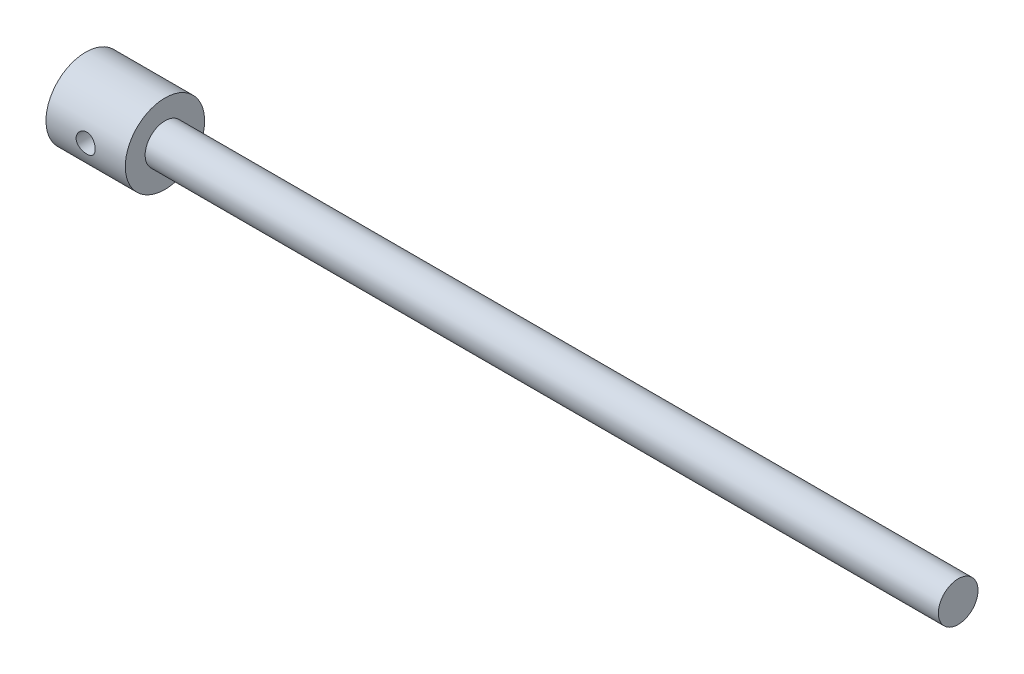
ISO-10303-21;
HEADER;
FILE_DESCRIPTION(('STEP AP214'),'2;1');
FILE_NAME('part.step','',(''),(''),'','','');
FILE_SCHEMA(('AUTOMOTIVE_DESIGN { 1 0 10303 214 1 1 1 1 }'));
ENDSEC;
DATA;
#1=APPLICATION_CONTEXT('core data for automotive mechanical design processes');
#2=APPLICATION_PROTOCOL_DEFINITION('international standard','automotive_design',2000,#1);
#3=PRODUCT_CONTEXT('',#1,'mechanical');
#4=PRODUCT('Part','Part','',(#3));
#5=PRODUCT_RELATED_PRODUCT_CATEGORY('part','',(#4));
#6=PRODUCT_DEFINITION_FORMATION('','',#4);
#7=PRODUCT_DEFINITION_CONTEXT('part definition',#1,'design');
#8=PRODUCT_DEFINITION('design','',#6,#7);
#9=PRODUCT_DEFINITION_SHAPE('','',#8);
#10=(LENGTH_UNIT() NAMED_UNIT(*) SI_UNIT(.MILLI.,.METRE.));
#11=(NAMED_UNIT(*) PLANE_ANGLE_UNIT() SI_UNIT($,.RADIAN.));
#12=(NAMED_UNIT(*) SI_UNIT($,.STERADIAN.) SOLID_ANGLE_UNIT());
#13=UNCERTAINTY_MEASURE_WITH_UNIT(LENGTH_MEASURE(1.E-05),#10,'distance_accuracy_value','');
#14=(GEOMETRIC_REPRESENTATION_CONTEXT(3) GLOBAL_UNCERTAINTY_ASSIGNED_CONTEXT((#13)) GLOBAL_UNIT_ASSIGNED_CONTEXT((#10,
#11,#12)) REPRESENTATION_CONTEXT('',''));
#15=CARTESIAN_POINT('',(0.,0.,0.));
#16=DIRECTION('',(0.,0.,1.));
#17=DIRECTION('',(1.,0.,0.));
#18=AXIS2_PLACEMENT_3D('',#15,#16,#17);
#19=CARTESIAN_POINT('',(0.,0.,0.));
#20=DIRECTION('',(-1.,0.,0.));
#21=DIRECTION('',(0.,-1.,0.));
#22=AXIS2_PLACEMENT_3D('',#19,#20,#21);
#23=PLANE('',#22);
#24=CARTESIAN_POINT('',(0.,0.,0.));
#25=DIRECTION('',(1.,0.,0.));
#26=DIRECTION('',(0.,1.,0.));
#27=AXIS2_PLACEMENT_3D('',#24,#25,#26);
#28=CIRCLE('',#27,25.);
#29=CARTESIAN_POINT('',(0.,25.,0.));
#30=VERTEX_POINT('',#29);
#31=EDGE_CURVE('E59',#30,#30,#28,.T.);
#32=ORIENTED_EDGE('',*,*,#31,.F.);
#33=EDGE_LOOP('',(#32));
#34=FACE_BOUND('',#33,.T.);
#35=ADVANCED_FACE('F43',(#34),#23,.T.);
#36=CARTESIAN_POINT('',(550.,0.,0.));
#37=DIRECTION('',(1.,0.,0.));
#38=DIRECTION('',(0.,1.,0.));
#39=AXIS2_PLACEMENT_3D('',#36,#37,#38);
#40=CYLINDRICAL_SURFACE('',#39,25.);
#41=CARTESIAN_POINT('',(31.,0.,-25.));
#42=CARTESIAN_POINT('',(31.0000045654021,-0.166017736340745,-25.0000026804997));
#43=CARTESIAN_POINT('',(30.9931083315099,-0.331984064130571,-24.9983437383731));
#44=CARTESIAN_POINT('',(30.9655909900526,-0.662757375273785,-24.9917601768854));
#45=CARTESIAN_POINT('',(30.9449681517169,-0.827564209779564,-24.9868351457074));
#46=CARTESIAN_POINT('',(30.8901535848326,-1.15483168687375,-24.9738504635424));
#47=CARTESIAN_POINT('',(30.855957043403,-1.31729147606247,-24.9657897007271));
#48=CARTESIAN_POINT('',(30.7742619207701,-1.63872050759381,-24.9467537443302));
#49=CARTESIAN_POINT('',(30.7267584397992,-1.79768844089951,-24.9357774773038));
#50=CARTESIAN_POINT('',(30.6189154000372,-2.11072366381165,-24.9112316091515));
#51=CARTESIAN_POINT('',(30.5585957367627,-2.26479812859839,-24.897666030887));
#52=CARTESIAN_POINT('',(30.4255126504005,-2.56731972417304,-24.8682925860487));
#53=CARTESIAN_POINT('',(30.3527446342751,-2.71576475309531,-24.8524838922068));
#54=CARTESIAN_POINT('',(30.1953429094483,-3.00593509691774,-24.8190587739081));
#55=CARTESIAN_POINT('',(30.1107137253609,-3.14766294672407,-24.8014430394569));
#56=CARTESIAN_POINT('',(29.930128760191,-3.42359889441685,-24.7648612187919));
#57=CARTESIAN_POINT('',(29.8341687278593,-3.55780414185136,-24.7458946268123));
#58=CARTESIAN_POINT('',(29.6298945004368,-3.81996752921303,-24.7067947855154));
#59=CARTESIAN_POINT('',(29.5214001376863,-3.94778319107671,-24.6866473068088));
#60=CARTESIAN_POINT('',(29.2940876458784,-4.19391043753479,-24.6460277155742));
#61=CARTESIAN_POINT('',(29.1752657022346,-4.31221847908384,-24.6255554853983));
#62=CARTESIAN_POINT('',(28.9281491358483,-4.53846894982133,-24.5848634527513));
#63=CARTESIAN_POINT('',(28.7998569991231,-4.64641408237687,-24.5646435856504));
#64=CARTESIAN_POINT('',(28.5345631328875,-4.85128465634762,-24.5250062264423));
#65=CARTESIAN_POINT('',(28.3975582064557,-4.94820601608992,-24.5055890332168));
#66=CARTESIAN_POINT('',(28.1139109412451,-5.1315149308875,-24.4678652790419));
#67=CARTESIAN_POINT('',(27.9671650785524,-5.21774615640803,-24.4495768107614));
#68=CARTESIAN_POINT('',(27.6666458172853,-5.37754406139993,-24.4149279468241));
#69=CARTESIAN_POINT('',(27.5128697930405,-5.45110595933349,-24.3985682798489));
#70=CARTESIAN_POINT('',(27.1994677660297,-5.58492026214268,-24.3682865029779));
#71=CARTESIAN_POINT('',(27.0398446450393,-5.64517912327471,-24.354363211339));
#72=CARTESIAN_POINT('',(26.7158528745254,-5.75195806967358,-24.3293636773731));
#73=CARTESIAN_POINT('',(26.5514825437586,-5.79847322039682,-24.3182884578029));
#74=CARTESIAN_POINT('',(26.0591991958386,-5.91523377010967,-24.2902598679583));
#75=CARTESIAN_POINT('',(25.7258747491139,-5.96534620186162,-24.2778811042379));
#76=CARTESIAN_POINT('',(25.2235243982438,-5.99819895021148,-24.2697663322526));
#77=CARTESIAN_POINT('',(25.055614512631,-6.00209048242323,-24.2688053008257));
#78=CARTESIAN_POINT('',(24.7200533387406,-5.99581246294926,-24.2703574949623));
#79=CARTESIAN_POINT('',(24.5524020533586,-5.98564275494965,-24.2728707591485));
#80=CARTESIAN_POINT('',(24.0592354379643,-5.93483975630032,-24.285368999466));
#81=CARTESIAN_POINT('',(23.7356610926301,-5.87440247397773,-24.3001939850224));
#82=CARTESIAN_POINT('',(23.1035551402389,-5.70184242669471,-24.3412549446464));
#83=CARTESIAN_POINT('',(22.7950245310886,-5.58971623816142,-24.3674916745551));
#84=CARTESIAN_POINT('',(22.1981876883057,-5.3158825349441,-24.4286958367201));
#85=CARTESIAN_POINT('',(21.9100987536133,-5.15371899452584,-24.4637429965247));
#86=CARTESIAN_POINT('',(21.3647873385141,-4.78473374953622,-24.5385748778448));
#87=CARTESIAN_POINT('',(21.1075698769835,-4.57790479882186,-24.5783603675971));
#88=CARTESIAN_POINT('',(20.6242138778088,-4.11902988641842,-24.6594640880418));
#89=CARTESIAN_POINT('',(20.3990660746999,-3.86594129003371,-24.7007951674045));
#90=CARTESIAN_POINT('',(19.9942302876759,-3.32511184695823,-24.7793903091839));
#91=CARTESIAN_POINT('',(19.8145434865743,-3.03737009894219,-24.8166542657671));
#92=CARTESIAN_POINT('',(19.5054056318309,-2.43405695507431,-24.8830789940348));
#93=CARTESIAN_POINT('',(19.3761051057317,-2.11840557448716,-24.9122154123614));
#94=CARTESIAN_POINT('',(19.1726698236987,-1.46899521159138,-24.9589240940734));
#95=CARTESIAN_POINT('',(19.0985253649671,-1.13523942521409,-24.9764983913503));
#96=CARTESIAN_POINT('',(19.0089958704804,-0.467574800827578,-24.9978055089126));
#97=CARTESIAN_POINT('',(18.9922601968733,-0.1338569665753,-25.0018564268946));
#98=CARTESIAN_POINT('',(19.0143335519038,0.531608768658084,-24.9965614831509));
#99=CARTESIAN_POINT('',(19.053137996564,0.863356829944316,-24.9872167270307));
#100=CARTESIAN_POINT('',(19.1840738854237,1.51084514007902,-24.9563832816127));
#101=CARTESIAN_POINT('',(19.2754779523593,1.8267410839496,-24.9350603275565));
#102=CARTESIAN_POINT('',(19.5081966502045,2.4387066749497,-24.8826669936479));
#103=CARTESIAN_POINT('',(19.6495160816406,2.73477441187555,-24.8515956762951));
#104=CARTESIAN_POINT('',(19.9807321749523,3.30412273668564,-24.7823820658762));
#105=CARTESIAN_POINT('',(20.171397626969,3.57694246966835,-24.7441307708391));
#106=CARTESIAN_POINT('',(20.5949176655097,4.08719914724014,-24.6649871461435));
#107=CARTESIAN_POINT('',(20.8277789307352,4.32463047973872,-24.6240943990594));
#108=CARTESIAN_POINT('',(21.3352671241418,4.76284500809665,-24.5431489449983));
#109=CARTESIAN_POINT('',(21.6107154179113,4.96268414096836,-24.5031358001301));
#110=CARTESIAN_POINT('',(22.1922356795911,5.31333575577366,-24.4295058119813));
#111=CARTESIAN_POINT('',(22.4983062754937,5.46415043292341,-24.395888682328));
#112=CARTESIAN_POINT('',(22.9725936839859,5.64963439053451,-24.353347630646));
#113=CARTESIAN_POINT('',(23.1328069566145,5.70458710242878,-24.3405033891164));
#114=CARTESIAN_POINT('',(23.457482020032,5.80079732294278,-24.317755202926));
#115=CARTESIAN_POINT('',(23.6219421871433,5.84205998439171,-24.3078501521252));
#116=CARTESIAN_POINT('',(23.9539179032292,5.91053741786634,-24.2912903166139));
#117=CARTESIAN_POINT('',(24.1214335511052,5.93775173433045,-24.2846356373073));
#118=CARTESIAN_POINT('',(24.4582664668551,5.97789965204539,-24.2747841701866));
#119=CARTESIAN_POINT('',(24.6275836538608,5.99083389159895,-24.2715872278157));
#120=CARTESIAN_POINT('',(24.9622487305118,6.00215499594078,-24.2687899616173));
#121=CARTESIAN_POINT('',(25.1275832844736,6.00091722515411,-24.2690968340135));
#122=CARTESIAN_POINT('',(25.4575435219348,5.98480872784869,-24.2730742483489));
#123=CARTESIAN_POINT('',(25.6221692208079,5.969938298505,-24.2767447169658));
#124=CARTESIAN_POINT('',(25.9495546015662,5.92668661056588,-24.2873399112073));
#125=CARTESIAN_POINT('',(26.1123139864982,5.89830323162515,-24.294265147542));
#126=CARTESIAN_POINT('',(26.4347302014815,5.82827196779405,-24.3111608262961));
#127=CARTESIAN_POINT('',(26.59438810625,5.78662876790753,-24.3211301931022));
#128=CARTESIAN_POINT('',(26.9088075189712,5.69063662986335,-24.3437686465433));
#129=CARTESIAN_POINT('',(27.0635886271826,5.63634876916799,-24.3564247302984));
#130=CARTESIAN_POINT('',(27.3679533881392,5.51539707483437,-24.3840980883562));
#131=CARTESIAN_POINT('',(27.5175388295994,5.44873755154826,-24.3991145400161));
#132=CARTESIAN_POINT('',(27.8106621669156,5.30348427217981,-24.4310987091682));
#133=CARTESIAN_POINT('',(27.9541973483356,5.22488523075194,-24.4480672900111));
#134=CARTESIAN_POINT('',(28.2341911451689,5.05635243091258,-24.4834782828489));
#135=CARTESIAN_POINT('',(28.3706520835145,4.96642242689347,-24.5019202059306));
#136=CARTESIAN_POINT('',(28.6389503832923,4.77346921711415,-24.5402505889388));
#137=CARTESIAN_POINT('',(28.7705923311298,4.67017903544834,-24.5601634300573));
#138=CARTESIAN_POINT('',(29.02470841849,4.45304880482868,-24.600458146359));
#139=CARTESIAN_POINT('',(29.1471856811229,4.33921237965749,-24.6208398586377));
#140=CARTESIAN_POINT('',(29.3822931129819,4.10164015488732,-24.661530300392));
#141=CARTESIAN_POINT('',(29.4949174263774,3.97789855094998,-24.6818389796797));
#142=CARTESIAN_POINT('',(29.7094481047576,3.7214296777047,-24.7218081005976));
#143=CARTESIAN_POINT('',(29.8113583669331,3.58870570477298,-24.7414687761375));
#144=CARTESIAN_POINT('',(30.0054239224954,3.31280088827595,-24.7799327781136));
#145=CARTESIAN_POINT('',(30.0973872483625,3.16948213881108,-24.7987162302532));
#146=CARTESIAN_POINT('',(30.2688530722884,2.87543817634771,-24.8345280560803));
#147=CARTESIAN_POINT('',(30.3483601559727,2.72471571591035,-24.8515570748485));
#148=CARTESIAN_POINT('',(30.4943122871475,2.41692354679156,-24.883375777664));
#149=CARTESIAN_POINT('',(30.5607634733439,2.25985686316148,-24.8981665133663));
#150=CARTESIAN_POINT('',(30.6801042720391,1.94048744711082,-24.9250921884147));
#151=CARTESIAN_POINT('',(30.7329960562763,1.77818555787967,-24.9372275530119));
#152=CARTESIAN_POINT('',(30.8520251734541,1.35190448336008,-24.9647957983314));
#153=CARTESIAN_POINT('',(30.9074241484908,1.08469226075994,-24.9779181465939));
#154=CARTESIAN_POINT('',(30.9814066442059,0.544940331071903,-24.9955177731159));
#155=CARTESIAN_POINT('',(30.9999925091139,0.272400964328516,-24.9999956018512));
#156=CARTESIAN_POINT('',(31.,0.,-25.));
#157=B_SPLINE_CURVE_WITH_KNOTS('',3,(#41,#42,#43,#44,#45,#46,#47,#48,#49,#50,#51,#52,#53,#54,
#55,#56,#57,#58,#59,#60,#61,#62,#63,#64,#65,#66,#67,#68,#69,#70,#71,#72,#73,#74,#75,#76,#77,#78,
#79,#80,#81,#82,#83,#84,#85,#86,#87,#88,#89,#90,#91,#92,#93,#94,#95,#96,#97,#98,#99,#100,#101,
#102,#103,#104,#105,#106,#107,#108,#109,#110,#111,#112,#113,#114,#115,#116,#117,#118,#119,#120,
#121,#122,#123,#124,#125,#126,#127,#128,#129,#130,#131,#132,#133,#134,#135,#136,#137,#138,#139,
#140,#141,#142,#143,#144,#145,#146,#147,#148,#149,#150,#151,#152,#153,#154,#155,#156),
.UNSPECIFIED.,.T.,.F.,(4,2,2,2,2,2,2,2,2,2,2,2,2,2,2,2,2,2,2,2,2,2,2,2,2,2,2,2,2,2,2,2,2,2,2,2,
2,2,2,2,2,2,2,2,2,2,2,2,2,2,2,2,2,2,2,2,2,4),(0.,0.497813360100955,0.995689500769747,
1.49374233325073,1.99197879609469,2.4894473877073,2.98709992652941,3.48456314269129,
3.98221359994714,4.48820831908741,4.99439073274951,5.50044073797176,6.00667750796929,
6.51961190143619,7.03273945954076,7.54561743540079,8.05867933189507,9.06463756237653,
9.56800871792682,10.0713854693234,11.0548629550302,12.0384055899336,13.0311908061742,
14.0241372047509,15.0430966233895,16.0620825507942,17.0840897493149,18.1059171185591,
19.1035329919673,20.1010665323702,21.085126203147,22.069280539993,23.0698021185097,
24.0704821968969,25.0936623603892,26.1167967016263,26.6258643414059,27.1347401541084,
27.6436324676663,28.1525020334114,28.6479253897995,29.1433379468293,29.6388282657176,
30.1341437102249,30.6271145113294,31.1199138801486,31.6129320389053,32.105787268885,
32.6107272666003,33.1154944014541,33.6205595212516,34.1254402854413,34.6387770201076,
35.1519243293048,35.6648297831432,36.1776530362049,36.9945144051894,37.8113237554193),.UNSPECIFIED.);
#158=CARTESIAN_POINT('',(31.,0.,-25.));
#159=VERTEX_POINT('',#158);
#160=EDGE_CURVE('E10',#159,#159,#157,.T.);
#161=ORIENTED_EDGE('',*,*,#160,.F.);
#162=EDGE_LOOP('',(#161));
#163=FACE_BOUND('',#162,.T.);
#164=CARTESIAN_POINT('',(31.,0.,25.));
#165=CARTESIAN_POINT('',(31.0000045654021,0.166017736340748,25.0000026804997));
#166=CARTESIAN_POINT('',(30.9931083315099,0.331984064130574,24.9983437383731));
#167=CARTESIAN_POINT('',(30.9655909900526,0.662757375273787,24.9917601768854));
#168=CARTESIAN_POINT('',(30.9449681517169,0.827564209779566,24.9868351457074));
#169=CARTESIAN_POINT('',(30.8901535848326,1.15483168687375,24.9738504635424));
#170=CARTESIAN_POINT('',(30.855957043403,1.31729147606248,24.9657897007271));
#171=CARTESIAN_POINT('',(30.7742619207701,1.63872050759382,24.9467537443302));
#172=CARTESIAN_POINT('',(30.7267584397992,1.79768844089951,24.9357774773038));
#173=CARTESIAN_POINT('',(30.6189154000372,2.11072366381165,24.9112316091515));
#174=CARTESIAN_POINT('',(30.5585957367627,2.26479812859839,24.897666030887));
#175=CARTESIAN_POINT('',(30.4255126504005,2.56731972417304,24.8682925860487));
#176=CARTESIAN_POINT('',(30.3527446342751,2.71576475309531,24.8524838922068));
#177=CARTESIAN_POINT('',(30.1953429094483,3.00593509691774,24.8190587739081));
#178=CARTESIAN_POINT('',(30.1107137253609,3.14766294672407,24.8014430394569));
#179=CARTESIAN_POINT('',(29.930128760191,3.42359889441685,24.7648612187919));
#180=CARTESIAN_POINT('',(29.8341687278593,3.55780414185136,24.7458946268123));
#181=CARTESIAN_POINT('',(29.6298945004368,3.81996752921303,24.7067947855154));
#182=CARTESIAN_POINT('',(29.5214001376863,3.94778319107671,24.6866473068088));
#183=CARTESIAN_POINT('',(29.2940876458784,4.19391043753479,24.6460277155742));
#184=CARTESIAN_POINT('',(29.1752657022346,4.31221847908384,24.6255554853983));
#185=CARTESIAN_POINT('',(28.9281491358483,4.53846894982133,24.5848634527513));
#186=CARTESIAN_POINT('',(28.7998569991231,4.64641408237687,24.5646435856504));
#187=CARTESIAN_POINT('',(28.5345631328875,4.85128465634762,24.5250062264423));
#188=CARTESIAN_POINT('',(28.3975582064557,4.94820601608992,24.5055890332168));
#189=CARTESIAN_POINT('',(28.1139109412451,5.1315149308875,24.4678652790419));
#190=CARTESIAN_POINT('',(27.9671650785524,5.21774615640803,24.4495768107614));
#191=CARTESIAN_POINT('',(27.6666458172853,5.37754406139993,24.4149279468241));
#192=CARTESIAN_POINT('',(27.5128697930405,5.45110595933349,24.3985682798489));
#193=CARTESIAN_POINT('',(27.1994677660297,5.58492026214268,24.3682865029779));
#194=CARTESIAN_POINT('',(27.0398446450393,5.64517912327471,24.354363211339));
#195=CARTESIAN_POINT('',(26.7158528745254,5.75195806967358,24.3293636773731));
#196=CARTESIAN_POINT('',(26.5514825437586,5.79847322039682,24.318288457803));
#197=CARTESIAN_POINT('',(26.0591991958386,5.91523377010968,24.2902598679583));
#198=CARTESIAN_POINT('',(25.7258747491139,5.96534620186162,24.2778811042379));
#199=CARTESIAN_POINT('',(25.2235243982438,5.99819895021148,24.2697663322526));
#200=CARTESIAN_POINT('',(25.055614512631,6.00209048242323,24.2688053008257));
#201=CARTESIAN_POINT('',(24.7200533387406,5.99581246294926,24.2703574949624));
#202=CARTESIAN_POINT('',(24.5524020533586,5.98564275494965,24.2728707591485));
#203=CARTESIAN_POINT('',(24.0592354379643,5.93483975630032,24.285368999466));
#204=CARTESIAN_POINT('',(23.7356610926301,5.87440247397773,24.3001939850224));
#205=CARTESIAN_POINT('',(23.1035551402389,5.70184242669471,24.3412549446464));
#206=CARTESIAN_POINT('',(22.7950245310886,5.58971623816142,24.3674916745551));
#207=CARTESIAN_POINT('',(22.1981876883057,5.3158825349441,24.4286958367201));
#208=CARTESIAN_POINT('',(21.9100987536133,5.15371899452584,24.4637429965247));
#209=CARTESIAN_POINT('',(21.3647873385141,4.78473374953621,24.5385748778448));
#210=CARTESIAN_POINT('',(21.1075698769834,4.57790479882186,24.5783603675971));
#211=CARTESIAN_POINT('',(20.6242138778088,4.11902988641842,24.6594640880418));
#212=CARTESIAN_POINT('',(20.3990660746999,3.86594129003371,24.7007951674045));
#213=CARTESIAN_POINT('',(19.9942302876759,3.32511184695823,24.7793903091839));
#214=CARTESIAN_POINT('',(19.8145434865743,3.03737009894219,24.8166542657671));
#215=CARTESIAN_POINT('',(19.5054056318309,2.43405695507431,24.8830789940348));
#216=CARTESIAN_POINT('',(19.3761051057317,2.11840557448716,24.9122154123614));
#217=CARTESIAN_POINT('',(19.1726698236987,1.46899521159138,24.9589240940734));
#218=CARTESIAN_POINT('',(19.0985253649671,1.13523942521409,24.9764983913503));
#219=CARTESIAN_POINT('',(19.0089958704804,0.467574800827575,24.9978055089126));
#220=CARTESIAN_POINT('',(18.9922601968733,0.133856966575298,25.0018564268946));
#221=CARTESIAN_POINT('',(19.0143335519038,-0.531608768658085,24.9965614831509));
#222=CARTESIAN_POINT('',(19.053137996564,-0.863356829944318,24.9872167270307));
#223=CARTESIAN_POINT('',(19.1840738854237,-1.51084514007902,24.9563832816127));
#224=CARTESIAN_POINT('',(19.2754779523593,-1.8267410839496,24.9350603275565));
#225=CARTESIAN_POINT('',(19.5081966502045,-2.4387066749497,24.8826669936479));
#226=CARTESIAN_POINT('',(19.6495160816406,-2.73477441187555,24.8515956762951));
#227=CARTESIAN_POINT('',(19.9807321749523,-3.30412273668564,24.7823820658762));
#228=CARTESIAN_POINT('',(20.171397626969,-3.57694246966835,24.7441307708391));
#229=CARTESIAN_POINT('',(20.5949176655097,-4.08719914724014,24.6649871461435));
#230=CARTESIAN_POINT('',(20.8277789307352,-4.32463047973872,24.6240943990594));
#231=CARTESIAN_POINT('',(21.3352671241418,-4.76284500809665,24.5431489449983));
#232=CARTESIAN_POINT('',(21.6107154179113,-4.96268414096836,24.5031358001301));
#233=CARTESIAN_POINT('',(22.1922356795911,-5.31333575577366,24.4295058119813));
#234=CARTESIAN_POINT('',(22.4983062754937,-5.46415043292341,24.395888682328));
#235=CARTESIAN_POINT('',(22.9725936839859,-5.64963439053451,24.353347630646));
#236=CARTESIAN_POINT('',(23.1328069566145,-5.70458710242878,24.3405033891164));
#237=CARTESIAN_POINT('',(23.457482020032,-5.80079732294278,24.317755202926));
#238=CARTESIAN_POINT('',(23.6219421871433,-5.84205998439171,24.3078501521252));
#239=CARTESIAN_POINT('',(23.9539179032292,-5.91053741786634,24.2912903166139));
#240=CARTESIAN_POINT('',(24.1214335511052,-5.93775173433045,24.2846356373073));
#241=CARTESIAN_POINT('',(24.4582664668551,-5.97789965204539,24.2747841701866));
#242=CARTESIAN_POINT('',(24.6275836538608,-5.99083389159895,24.2715872278157));
#243=CARTESIAN_POINT('',(24.9622487305118,-6.00215499594078,24.2687899616173));
#244=CARTESIAN_POINT('',(25.1275832844736,-6.00091722515411,24.2690968340135));
#245=CARTESIAN_POINT('',(25.4575435219348,-5.98480872784869,24.2730742483489));
#246=CARTESIAN_POINT('',(25.6221692208079,-5.969938298505,24.2767447169658));
#247=CARTESIAN_POINT('',(25.9495546015662,-5.92668661056588,24.2873399112073));
#248=CARTESIAN_POINT('',(26.1123139864983,-5.89830323162515,24.294265147542));
#249=CARTESIAN_POINT('',(26.4347302014815,-5.82827196779404,24.3111608262961));
#250=CARTESIAN_POINT('',(26.59438810625,-5.78662876790753,24.3211301931022));
#251=CARTESIAN_POINT('',(26.9088075189712,-5.69063662986335,24.3437686465433));
#252=CARTESIAN_POINT('',(27.0635886271826,-5.63634876916799,24.3564247302984));
#253=CARTESIAN_POINT('',(27.3679533881392,-5.51539707483437,24.3840980883562));
#254=CARTESIAN_POINT('',(27.5175388295994,-5.44873755154826,24.3991145400161));
#255=CARTESIAN_POINT('',(27.8106621669156,-5.30348427217981,24.4310987091682));
#256=CARTESIAN_POINT('',(27.9541973483356,-5.22488523075194,24.4480672900111));
#257=CARTESIAN_POINT('',(28.2341911451689,-5.05635243091258,24.4834782828489));
#258=CARTESIAN_POINT('',(28.3706520835145,-4.96642242689347,24.5019202059306));
#259=CARTESIAN_POINT('',(28.6389503832923,-4.77346921711415,24.5402505889388));
#260=CARTESIAN_POINT('',(28.7705923311298,-4.67017903544834,24.5601634300573));
#261=CARTESIAN_POINT('',(29.02470841849,-4.45304880482868,24.600458146359));
#262=CARTESIAN_POINT('',(29.1471856811229,-4.33921237965749,24.6208398586377));
#263=CARTESIAN_POINT('',(29.3822931129819,-4.10164015488732,24.661530300392));
#264=CARTESIAN_POINT('',(29.4949174263774,-3.97789855094999,24.6818389796797));
#265=CARTESIAN_POINT('',(29.7094481047576,-3.7214296777047,24.7218081005976));
#266=CARTESIAN_POINT('',(29.8113583669331,-3.58870570477298,24.7414687761375));
#267=CARTESIAN_POINT('',(30.0054239224954,-3.31280088827595,24.7799327781136));
#268=CARTESIAN_POINT('',(30.0973872483625,-3.16948213881108,24.7987162302532));
#269=CARTESIAN_POINT('',(30.2688530722884,-2.87543817634771,24.8345280560803));
#270=CARTESIAN_POINT('',(30.3483601559727,-2.72471571591035,24.8515570748485));
#271=CARTESIAN_POINT('',(30.4943122871475,-2.41692354679156,24.883375777664));
#272=CARTESIAN_POINT('',(30.5607634733439,-2.25985686316148,24.8981665133663));
#273=CARTESIAN_POINT('',(30.6801042720391,-1.94048744711082,24.9250921884147));
#274=CARTESIAN_POINT('',(30.7329960562763,-1.77818555787967,24.9372275530119));
#275=CARTESIAN_POINT('',(30.8520251734541,-1.35190448336008,24.9647957983314));
#276=CARTESIAN_POINT('',(30.9074241484908,-1.08469226075993,24.9779181465939));
#277=CARTESIAN_POINT('',(30.9814066442059,-0.544940331071898,24.9955177731159));
#278=CARTESIAN_POINT('',(30.9999925091139,-0.272400964328512,24.9999956018512));
#279=CARTESIAN_POINT('',(31.,0.,25.));
#280=B_SPLINE_CURVE_WITH_KNOTS('',3,(#164,#165,#166,#167,#168,#169,#170,#171,#172,#173,#174,
#175,#176,#177,#178,#179,#180,#181,#182,#183,#184,#185,#186,#187,#188,#189,#190,#191,#192,#193,
#194,#195,#196,#197,#198,#199,#200,#201,#202,#203,#204,#205,#206,#207,#208,#209,#210,#211,#212,
#213,#214,#215,#216,#217,#218,#219,#220,#221,#222,#223,#224,#225,#226,#227,#228,#229,#230,#231,
#232,#233,#234,#235,#236,#237,#238,#239,#240,#241,#242,#243,#244,#245,#246,#247,#248,#249,#250,
#251,#252,#253,#254,#255,#256,#257,#258,#259,#260,#261,#262,#263,#264,#265,#266,#267,#268,#269,
#270,#271,#272,#273,#274,#275,#276,#277,#278,#279),.UNSPECIFIED.,.T.,.F.,(4,2,2,2,2,2,2,2,2,2,2,
2,2,2,2,2,2,2,2,2,2,2,2,2,2,2,2,2,2,2,2,2,2,2,2,2,2,2,2,2,2,2,2,2,2,2,2,2,2,2,2,2,2,2,2,2,2,4),
(0.,0.497813360100954,0.995689500769747,1.49374233325073,1.99197879609469,2.4894473877073,
2.98709992652941,3.48456314269129,3.98221359994714,4.48820831908741,4.99439073274951,
5.50044073797176,6.00667750796928,6.51961190143619,7.03273945954075,7.54561743540079,
8.05867933189507,9.06463756237654,9.56800871792682,10.0713854693234,11.0548629550302,
12.0384055899336,13.0311908061742,14.0241372047509,15.0430966233895,16.0620825507942,
17.0840897493149,18.1059171185591,19.1035329919673,20.1010665323702,21.085126203147,
22.069280539993,23.0698021185097,24.0704821968969,25.0936623603892,26.1167967016263,
26.6258643414059,27.1347401541084,27.6436324676663,28.1525020334114,28.6479253897995,
29.1433379468293,29.6388282657176,30.1341437102249,30.6271145113294,31.1199138801486,
31.6129320389053,32.105787268885,32.6107272666003,33.1154944014541,33.6205595212516,
34.1254402854413,34.6387770201076,35.1519243293048,35.6648297831432,36.1776530362049,
36.9945144051894,37.8113237554193),.UNSPECIFIED.);
#281=CARTESIAN_POINT('',(31.,0.,25.));
#282=VERTEX_POINT('',#281);
#283=EDGE_CURVE('E54',#282,#282,#280,.T.);
#284=ORIENTED_EDGE('',*,*,#283,.F.);
#285=EDGE_LOOP('',(#284));
#286=FACE_BOUND('',#285,.T.);
#287=ORIENTED_EDGE('',*,*,#31,.T.);
#288=EDGE_LOOP('',(#287));
#289=FACE_BOUND('',#288,.T.);
#290=CARTESIAN_POINT('',(50.,0.,0.));
#291=DIRECTION('',(1.,0.,0.));
#292=DIRECTION('',(0.,1.,0.));
#293=AXIS2_PLACEMENT_3D('',#290,#291,#292);
#294=CIRCLE('',#293,25.);
#295=CARTESIAN_POINT('',(50.,25.,0.));
#296=VERTEX_POINT('',#295);
#297=EDGE_CURVE('E64',#296,#296,#294,.T.);
#298=ORIENTED_EDGE('',*,*,#297,.F.);
#299=EDGE_LOOP('',(#298));
#300=FACE_BOUND('',#299,.T.);
#301=ADVANCED_FACE('F70',(#163,#286,#289,#300),#40,.T.);
#302=CARTESIAN_POINT('',(50.,25.,0.));
#303=DIRECTION('',(1.,0.,0.));
#304=DIRECTION('',(0.,1.,0.));
#305=AXIS2_PLACEMENT_3D('',#302,#303,#304);
#306=PLANE('',#305);
#307=ORIENTED_EDGE('',*,*,#297,.T.);
#308=EDGE_LOOP('',(#307));
#309=FACE_BOUND('',#308,.T.);
#310=CARTESIAN_POINT('',(50.,0.,0.));
#311=DIRECTION('',(1.,0.,0.));
#312=DIRECTION('',(0.,1.,0.));
#313=AXIS2_PLACEMENT_3D('',#310,#311,#312);
#314=CIRCLE('',#313,12.5);
#315=CARTESIAN_POINT('',(50.,12.5,0.));
#316=VERTEX_POINT('',#315);
#317=EDGE_CURVE('E103',#316,#316,#314,.T.);
#318=ORIENTED_EDGE('',*,*,#317,.F.);
#319=EDGE_LOOP('',(#318));
#320=FACE_BOUND('',#319,.T.);
#321=ADVANCED_FACE('F84',(#309,#320),#306,.T.);
#322=CARTESIAN_POINT('',(550.,0.,0.));
#323=DIRECTION('',(1.,0.,0.));
#324=DIRECTION('',(0.,1.,0.));
#325=AXIS2_PLACEMENT_3D('',#322,#323,#324);
#326=CYLINDRICAL_SURFACE('',#325,12.5);
#327=ORIENTED_EDGE('',*,*,#317,.T.);
#328=EDGE_LOOP('',(#327));
#329=FACE_BOUND('',#328,.T.);
#330=CARTESIAN_POINT('',(550.,0.,0.));
#331=DIRECTION('',(1.,0.,0.));
#332=DIRECTION('',(0.,1.,0.));
#333=AXIS2_PLACEMENT_3D('',#330,#331,#332);
#334=CIRCLE('',#333,12.4999999999999);
#335=CARTESIAN_POINT('',(550.,12.5,0.));
#336=VERTEX_POINT('',#335);
#337=EDGE_CURVE('E106',#336,#336,#334,.T.);
#338=ORIENTED_EDGE('',*,*,#337,.F.);
#339=EDGE_LOOP('',(#338));
#340=FACE_BOUND('',#339,.T.);
#341=ADVANCED_FACE('F81',(#329,#340),#326,.T.);
#342=CARTESIAN_POINT('',(550.,12.5,0.));
#343=DIRECTION('',(1.,0.,0.));
#344=DIRECTION('',(0.,1.,0.));
#345=AXIS2_PLACEMENT_3D('',#342,#343,#344);
#346=PLANE('',#345);
#347=ORIENTED_EDGE('',*,*,#337,.T.);
#348=EDGE_LOOP('',(#347));
#349=FACE_BOUND('',#348,.T.);
#350=ADVANCED_FACE('F77',(#349),#346,.T.);
#351=CARTESIAN_POINT('',(25.,0.,-25.));
#352=DIRECTION('',(0.,0.,1.));
#353=DIRECTION('',(1.,0.,0.));
#354=AXIS2_PLACEMENT_3D('',#351,#352,#353);
#355=CYLINDRICAL_SURFACE('',#354,6.);
#356=ORIENTED_EDGE('',*,*,#160,.T.);
#357=EDGE_LOOP('',(#356));
#358=FACE_BOUND('',#357,.T.);
#359=ORIENTED_EDGE('',*,*,#283,.T.);
#360=EDGE_LOOP('',(#359));
#361=FACE_BOUND('',#360,.T.);
#362=ADVANCED_FACE('F73',(#358,#361),#355,.F.);
#363=CLOSED_SHELL('',(#35,#301,#321,#341,#350,#362));
#364=MANIFOLD_SOLID_BREP('B2',#363);
#365=ADVANCED_BREP_SHAPE_REPRESENTATION('',(#18,#364),#14);
#366=SHAPE_DEFINITION_REPRESENTATION(#9,#365);
ENDSEC;
END-ISO-10303-21;
